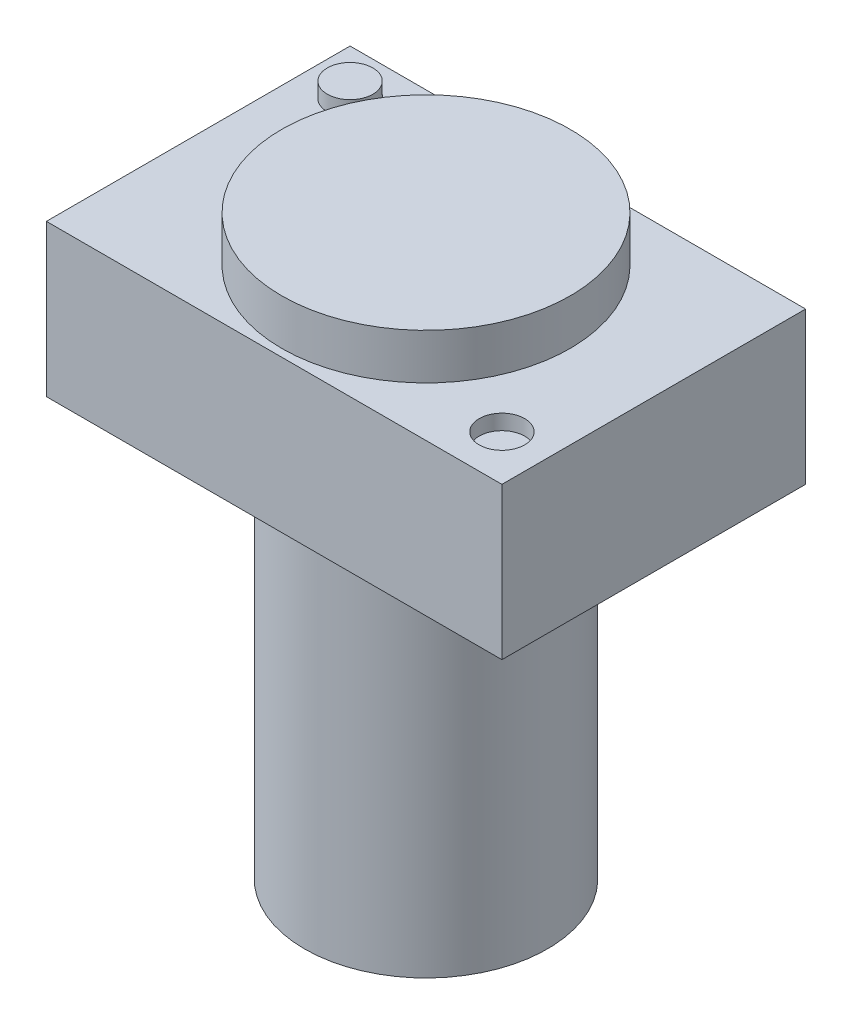
ISO-10303-21;
HEADER;
FILE_DESCRIPTION(('STEP AP214'),'2;1');
FILE_NAME('part.step','',(''),(''),'','','');
FILE_SCHEMA(('AUTOMOTIVE_DESIGN { 1 0 10303 214 1 1 1 1 }'));
ENDSEC;
DATA;
#1=APPLICATION_CONTEXT('core data for automotive mechanical design processes');
#2=APPLICATION_PROTOCOL_DEFINITION('international standard','automotive_design',2000,#1);
#3=PRODUCT_CONTEXT('',#1,'mechanical');
#4=PRODUCT('Part','Part','',(#3));
#5=PRODUCT_RELATED_PRODUCT_CATEGORY('part','',(#4));
#6=PRODUCT_DEFINITION_FORMATION('','',#4);
#7=PRODUCT_DEFINITION_CONTEXT('part definition',#1,'design');
#8=PRODUCT_DEFINITION('design','',#6,#7);
#9=PRODUCT_DEFINITION_SHAPE('','',#8);
#10=(LENGTH_UNIT() NAMED_UNIT(*) SI_UNIT(.MILLI.,.METRE.));
#11=(NAMED_UNIT(*) PLANE_ANGLE_UNIT() SI_UNIT($,.RADIAN.));
#12=(NAMED_UNIT(*) SI_UNIT($,.STERADIAN.) SOLID_ANGLE_UNIT());
#13=UNCERTAINTY_MEASURE_WITH_UNIT(LENGTH_MEASURE(1.E-05),#10,'distance_accuracy_value','');
#14=(GEOMETRIC_REPRESENTATION_CONTEXT(3) GLOBAL_UNCERTAINTY_ASSIGNED_CONTEXT((#13)) GLOBAL_UNIT_ASSIGNED_CONTEXT((#10,
#11,#12)) REPRESENTATION_CONTEXT('',''));
#15=CARTESIAN_POINT('',(0.,0.,0.));
#16=DIRECTION('',(0.,0.,1.));
#17=DIRECTION('',(1.,0.,0.));
#18=AXIS2_PLACEMENT_3D('',#15,#16,#17);
#19=CARTESIAN_POINT('',(0.,-10.,0.));
#20=DIRECTION('',(-1.,0.,0.));
#21=DIRECTION('',(0.,0.,1.));
#22=AXIS2_PLACEMENT_3D('',#19,#20,#21);
#23=PLANE('',#22);
#24=DIRECTION('',(0.,0.,1.));
#25=VECTOR('',#24,1.);
#26=CARTESIAN_POINT('',(0.,0.,0.));
#27=LINE('',#26,#25);
#28=CARTESIAN_POINT('',(0.,0.,-20.));
#29=VERTEX_POINT('',#28);
#30=CARTESIAN_POINT('',(0.,0.,0.));
#31=VERTEX_POINT('',#30);
#32=EDGE_CURVE('E117',#29,#31,#27,.T.);
#33=ORIENTED_EDGE('',*,*,#32,.F.);
#34=DIRECTION('',(0.,1.,0.));
#35=VECTOR('',#34,1.);
#36=CARTESIAN_POINT('',(0.,-10.,-20.));
#37=LINE('',#36,#35);
#38=CARTESIAN_POINT('',(0.,-10.,-20.));
#39=VERTEX_POINT('',#38);
#40=EDGE_CURVE('E58',#39,#29,#37,.T.);
#41=ORIENTED_EDGE('',*,*,#40,.F.);
#42=DIRECTION('',(0.,0.,1.));
#43=VECTOR('',#42,1.);
#44=CARTESIAN_POINT('',(0.,-10.,0.));
#45=LINE('',#44,#43);
#46=CARTESIAN_POINT('',(0.,-10.,0.));
#47=VERTEX_POINT('',#46);
#48=EDGE_CURVE('E106',#39,#47,#45,.T.);
#49=ORIENTED_EDGE('',*,*,#48,.T.);
#50=DIRECTION('',(0.,1.,0.));
#51=VECTOR('',#50,1.);
#52=CARTESIAN_POINT('',(0.,-10.,0.));
#53=LINE('',#52,#51);
#54=EDGE_CURVE('E86',#47,#31,#53,.T.);
#55=ORIENTED_EDGE('',*,*,#54,.T.);
#56=EDGE_LOOP('',(#33,#41,#49,#55));
#57=FACE_BOUND('',#56,.T.);
#58=ADVANCED_FACE('F41',(#57),#23,.T.);
#59=CARTESIAN_POINT('',(0.,-10.,-20.));
#60=DIRECTION('',(0.,0.,-1.));
#61=DIRECTION('',(-1.,0.,0.));
#62=AXIS2_PLACEMENT_3D('',#59,#60,#61);
#63=PLANE('',#62);
#64=DIRECTION('',(-1.,0.,0.));
#65=VECTOR('',#64,1.);
#66=CARTESIAN_POINT('',(0.,0.,-20.));
#67=LINE('',#66,#65);
#68=CARTESIAN_POINT('',(30.,0.,-20.));
#69=VERTEX_POINT('',#68);
#70=EDGE_CURVE('E111',#69,#29,#67,.T.);
#71=ORIENTED_EDGE('',*,*,#70,.F.);
#72=DIRECTION('',(0.,1.,0.));
#73=VECTOR('',#72,1.);
#74=CARTESIAN_POINT('',(30.,-10.,-20.));
#75=LINE('',#74,#73);
#76=CARTESIAN_POINT('',(30.,-10.,-20.));
#77=VERTEX_POINT('',#76);
#78=EDGE_CURVE('E75',#77,#69,#75,.T.);
#79=ORIENTED_EDGE('',*,*,#78,.F.);
#80=DIRECTION('',(-1.,0.,0.));
#81=VECTOR('',#80,1.);
#82=CARTESIAN_POINT('',(0.,-10.,-20.));
#83=LINE('',#82,#81);
#84=EDGE_CURVE('E101',#77,#39,#83,.T.);
#85=ORIENTED_EDGE('',*,*,#84,.T.);
#86=ORIENTED_EDGE('',*,*,#40,.T.);
#87=EDGE_LOOP('',(#71,#79,#85,#86));
#88=FACE_BOUND('',#87,.T.);
#89=ADVANCED_FACE('F139',(#88),#63,.T.);
#90=CARTESIAN_POINT('',(30.,-10.,0.));
#91=DIRECTION('',(1.,0.,0.));
#92=DIRECTION('',(0.,0.,-1.));
#93=AXIS2_PLACEMENT_3D('',#90,#91,#92);
#94=PLANE('',#93);
#95=DIRECTION('',(0.,0.,-1.));
#96=VECTOR('',#95,1.);
#97=CARTESIAN_POINT('',(30.,0.,0.));
#98=LINE('',#97,#96);
#99=CARTESIAN_POINT('',(30.,0.,0.));
#100=VERTEX_POINT('',#99);
#101=EDGE_CURVE('E94',#100,#69,#98,.T.);
#102=ORIENTED_EDGE('',*,*,#101,.F.);
#103=DIRECTION('',(0.,1.,0.));
#104=VECTOR('',#103,1.);
#105=CARTESIAN_POINT('',(30.,-10.,0.));
#106=LINE('',#105,#104);
#107=CARTESIAN_POINT('',(30.,-10.,0.));
#108=VERTEX_POINT('',#107);
#109=EDGE_CURVE('E89',#108,#100,#106,.T.);
#110=ORIENTED_EDGE('',*,*,#109,.F.);
#111=DIRECTION('',(0.,0.,-1.));
#112=VECTOR('',#111,1.);
#113=CARTESIAN_POINT('',(30.,-10.,0.));
#114=LINE('',#113,#112);
#115=EDGE_CURVE('E92',#108,#77,#114,.T.);
#116=ORIENTED_EDGE('',*,*,#115,.T.);
#117=ORIENTED_EDGE('',*,*,#78,.T.);
#118=EDGE_LOOP('',(#102,#110,#116,#117));
#119=FACE_BOUND('',#118,.T.);
#120=ADVANCED_FACE('F91',(#119),#94,.T.);
#121=CARTESIAN_POINT('',(0.,-10.,0.));
#122=DIRECTION('',(0.,0.,1.));
#123=DIRECTION('',(1.,0.,0.));
#124=AXIS2_PLACEMENT_3D('',#121,#122,#123);
#125=PLANE('',#124);
#126=DIRECTION('',(1.,0.,0.));
#127=VECTOR('',#126,1.);
#128=CARTESIAN_POINT('',(0.,0.,0.));
#129=LINE('',#128,#127);
#130=EDGE_CURVE('E121',#31,#100,#129,.T.);
#131=ORIENTED_EDGE('',*,*,#130,.F.);
#132=ORIENTED_EDGE('',*,*,#54,.F.);
#133=DIRECTION('',(1.,0.,0.));
#134=VECTOR('',#133,1.);
#135=CARTESIAN_POINT('',(0.,-10.,0.));
#136=LINE('',#135,#134);
#137=EDGE_CURVE('E100',#47,#108,#136,.T.);
#138=ORIENTED_EDGE('',*,*,#137,.T.);
#139=ORIENTED_EDGE('',*,*,#109,.T.);
#140=EDGE_LOOP('',(#131,#132,#138,#139));
#141=FACE_BOUND('',#140,.T.);
#142=ADVANCED_FACE('F104',(#141),#125,.T.);
#143=CARTESIAN_POINT('',(0.,-10.,0.));
#144=DIRECTION('',(0.,-1.,0.));
#145=DIRECTION('',(0.,0.,-1.));
#146=AXIS2_PLACEMENT_3D('',#143,#144,#145);
#147=PLANE('',#146);
#148=CARTESIAN_POINT('',(15.,-10.,-10.));
#149=DIRECTION('',(0.,-1.,0.));
#150=DIRECTION('',(0.,0.,-1.));
#151=AXIS2_PLACEMENT_3D('',#148,#149,#150);
#152=CIRCLE('',#151,8.);
#153=CARTESIAN_POINT('',(15.,-10.,-18.));
#154=VERTEX_POINT('',#153);
#155=EDGE_CURVE('E132',#154,#154,#152,.T.);
#156=ORIENTED_EDGE('',*,*,#155,.F.);
#157=EDGE_LOOP('',(#156));
#158=FACE_BOUND('',#157,.T.);
#159=ORIENTED_EDGE('',*,*,#48,.F.);
#160=ORIENTED_EDGE('',*,*,#84,.F.);
#161=ORIENTED_EDGE('',*,*,#115,.F.);
#162=ORIENTED_EDGE('',*,*,#137,.F.);
#163=EDGE_LOOP('',(#159,#160,#161,#162));
#164=FACE_BOUND('',#163,.T.);
#165=ADVANCED_FACE('F99',(#158,#164),#147,.T.);
#166=CARTESIAN_POINT('',(0.,0.,0.));
#167=DIRECTION('',(0.,-1.,0.));
#168=DIRECTION('',(0.,0.,-1.));
#169=AXIS2_PLACEMENT_3D('',#166,#167,#168);
#170=PLANE('',#169);
#171=CARTESIAN_POINT('',(27.,0.,-3.));
#172=DIRECTION('',(0.,1.,0.));
#173=DIRECTION('',(0.,0.,1.));
#174=AXIS2_PLACEMENT_3D('',#171,#172,#173);
#175=CIRCLE('',#174,1.5);
#176=CARTESIAN_POINT('',(27.,0.,-1.5));
#177=VERTEX_POINT('',#176);
#178=EDGE_CURVE('E198',#177,#177,#175,.T.);
#179=ORIENTED_EDGE('',*,*,#178,.F.);
#180=EDGE_LOOP('',(#179));
#181=FACE_BOUND('',#180,.T.);
#182=CARTESIAN_POINT('',(3.,0.,-17.));
#183=DIRECTION('',(0.,-1.,0.));
#184=DIRECTION('',(0.,0.,-1.));
#185=AXIS2_PLACEMENT_3D('',#182,#183,#184);
#186=CIRCLE('',#185,1.5);
#187=CARTESIAN_POINT('',(3.,0.,-18.5));
#188=VERTEX_POINT('',#187);
#189=EDGE_CURVE('E11',#188,#188,#186,.F.);
#190=ORIENTED_EDGE('',*,*,#189,.F.);
#191=EDGE_LOOP('',(#190));
#192=FACE_BOUND('',#191,.T.);
#193=CARTESIAN_POINT('',(15.,0.,-10.));
#194=DIRECTION('',(0.,1.,0.));
#195=DIRECTION('',(0.,0.,1.));
#196=AXIS2_PLACEMENT_3D('',#193,#194,#195);
#197=CIRCLE('',#196,9.5);
#198=CARTESIAN_POINT('',(15.,0.,-0.499999999999999));
#199=VERTEX_POINT('',#198);
#200=EDGE_CURVE('E50',#199,#199,#197,.T.);
#201=ORIENTED_EDGE('',*,*,#200,.F.);
#202=EDGE_LOOP('',(#201));
#203=FACE_BOUND('',#202,.T.);
#204=ORIENTED_EDGE('',*,*,#32,.T.);
#205=ORIENTED_EDGE('',*,*,#130,.T.);
#206=ORIENTED_EDGE('',*,*,#101,.T.);
#207=ORIENTED_EDGE('',*,*,#70,.T.);
#208=EDGE_LOOP('',(#204,#205,#206,#207));
#209=FACE_BOUND('',#208,.T.);
#210=ADVANCED_FACE('F138',(#181,#192,#203,#209),#170,.F.);
#211=CARTESIAN_POINT('',(15.,-35.,-10.));
#212=DIRECTION('',(0.,1.,0.));
#213=DIRECTION('',(0.,0.,1.));
#214=AXIS2_PLACEMENT_3D('',#211,#212,#213);
#215=CYLINDRICAL_SURFACE('',#214,8.);
#216=CARTESIAN_POINT('',(15.,-35.,-10.));
#217=DIRECTION('',(0.,-1.,0.));
#218=DIRECTION('',(0.,0.,-1.));
#219=AXIS2_PLACEMENT_3D('',#216,#217,#218);
#220=CIRCLE('',#219,8.);
#221=CARTESIAN_POINT('',(15.,-35.,-18.));
#222=VERTEX_POINT('',#221);
#223=EDGE_CURVE('E122',#222,#222,#220,.T.);
#224=ORIENTED_EDGE('',*,*,#223,.F.);
#225=EDGE_LOOP('',(#224));
#226=FACE_BOUND('',#225,.T.);
#227=ORIENTED_EDGE('',*,*,#155,.T.);
#228=EDGE_LOOP('',(#227));
#229=FACE_BOUND('',#228,.T.);
#230=ADVANCED_FACE('F157',(#226,#229),#215,.T.);
#231=CARTESIAN_POINT('',(15.,-35.,-10.));
#232=DIRECTION('',(0.,-1.,0.));
#233=DIRECTION('',(0.,0.,-1.));
#234=AXIS2_PLACEMENT_3D('',#231,#232,#233);
#235=PLANE('',#234);
#236=ORIENTED_EDGE('',*,*,#223,.T.);
#237=EDGE_LOOP('',(#236));
#238=FACE_BOUND('',#237,.T.);
#239=ADVANCED_FACE('F163',(#238),#235,.T.);
#240=CARTESIAN_POINT('',(15.,3.,-10.));
#241=DIRECTION('',(0.,-1.,0.));
#242=DIRECTION('',(0.,0.,-1.));
#243=AXIS2_PLACEMENT_3D('',#240,#241,#242);
#244=CYLINDRICAL_SURFACE('',#243,9.5);
#245=CARTESIAN_POINT('',(15.,3.,-10.));
#246=DIRECTION('',(0.,1.,0.));
#247=DIRECTION('',(0.,0.,1.));
#248=AXIS2_PLACEMENT_3D('',#245,#246,#247);
#249=CIRCLE('',#248,9.5);
#250=CARTESIAN_POINT('',(15.,3.,-0.499999999999999));
#251=VERTEX_POINT('',#250);
#252=EDGE_CURVE('E205',#251,#251,#249,.T.);
#253=ORIENTED_EDGE('',*,*,#252,.F.);
#254=EDGE_LOOP('',(#253));
#255=FACE_BOUND('',#254,.T.);
#256=ORIENTED_EDGE('',*,*,#200,.T.);
#257=EDGE_LOOP('',(#256));
#258=FACE_BOUND('',#257,.T.);
#259=ADVANCED_FACE('F167',(#255,#258),#244,.T.);
#260=CARTESIAN_POINT('',(15.,3.,-10.));
#261=DIRECTION('',(0.,1.,0.));
#262=DIRECTION('',(0.,0.,1.));
#263=AXIS2_PLACEMENT_3D('',#260,#261,#262);
#264=PLANE('',#263);
#265=ORIENTED_EDGE('',*,*,#252,.T.);
#266=EDGE_LOOP('',(#265));
#267=FACE_BOUND('',#266,.T.);
#268=ADVANCED_FACE('F171',(#267),#264,.T.);
#269=CARTESIAN_POINT('',(3.,1.,-17.));
#270=DIRECTION('',(0.,-1.,0.));
#271=DIRECTION('',(0.,0.,-1.));
#272=AXIS2_PLACEMENT_3D('',#269,#270,#271);
#273=CYLINDRICAL_SURFACE('',#272,1.5);
#274=CARTESIAN_POINT('',(3.,1.,-17.));
#275=DIRECTION('',(0.,1.,0.));
#276=DIRECTION('',(0.,0.,1.));
#277=AXIS2_PLACEMENT_3D('',#274,#275,#276);
#278=CIRCLE('',#277,1.5);
#279=CARTESIAN_POINT('',(3.,1.,-15.5));
#280=VERTEX_POINT('',#279);
#281=EDGE_CURVE('E197',#280,#280,#278,.T.);
#282=ORIENTED_EDGE('',*,*,#281,.F.);
#283=EDGE_LOOP('',(#282));
#284=FACE_BOUND('',#283,.T.);
#285=ORIENTED_EDGE('',*,*,#189,.T.);
#286=EDGE_LOOP('',(#285));
#287=FACE_BOUND('',#286,.T.);
#288=ADVANCED_FACE('F175',(#284,#287),#273,.T.);
#289=CARTESIAN_POINT('',(3.,1.,-17.));
#290=DIRECTION('',(0.,1.,0.));
#291=DIRECTION('',(0.,0.,1.));
#292=AXIS2_PLACEMENT_3D('',#289,#290,#291);
#293=PLANE('',#292);
#294=ORIENTED_EDGE('',*,*,#281,.T.);
#295=EDGE_LOOP('',(#294));
#296=FACE_BOUND('',#295,.T.);
#297=ADVANCED_FACE('F179',(#296),#293,.T.);
#298=CARTESIAN_POINT('',(27.,-1.,-3.));
#299=DIRECTION('',(0.,1.,0.));
#300=DIRECTION('',(0.,0.,1.));
#301=AXIS2_PLACEMENT_3D('',#298,#299,#300);
#302=CYLINDRICAL_SURFACE('',#301,1.5);
#303=CARTESIAN_POINT('',(27.,-1.,-3.));
#304=DIRECTION('',(0.,1.,0.));
#305=DIRECTION('',(0.,0.,1.));
#306=AXIS2_PLACEMENT_3D('',#303,#304,#305);
#307=CIRCLE('',#306,1.5);
#308=CARTESIAN_POINT('',(27.,-1.,-1.5));
#309=VERTEX_POINT('',#308);
#310=EDGE_CURVE('E195',#309,#309,#307,.T.);
#311=ORIENTED_EDGE('',*,*,#310,.F.);
#312=EDGE_LOOP('',(#311));
#313=FACE_BOUND('',#312,.T.);
#314=ORIENTED_EDGE('',*,*,#178,.T.);
#315=EDGE_LOOP('',(#314));
#316=FACE_BOUND('',#315,.T.);
#317=ADVANCED_FACE('F183',(#313,#316),#302,.F.);
#318=CARTESIAN_POINT('',(27.,-1.,-3.));
#319=DIRECTION('',(0.,1.,0.));
#320=DIRECTION('',(0.,0.,1.));
#321=AXIS2_PLACEMENT_3D('',#318,#319,#320);
#322=PLANE('',#321);
#323=ORIENTED_EDGE('',*,*,#310,.T.);
#324=EDGE_LOOP('',(#323));
#325=FACE_BOUND('',#324,.T.);
#326=ADVANCED_FACE('F187',(#325),#322,.T.);
#327=CLOSED_SHELL('',(#58,#89,#120,#142,#165,#210,#230,#239,#259,#268,#288,#297,#317,#326));
#328=MANIFOLD_SOLID_BREP('B2',#327);
#329=ADVANCED_BREP_SHAPE_REPRESENTATION('',(#18,#328),#14);
#330=SHAPE_DEFINITION_REPRESENTATION(#9,#329);
ENDSEC;
END-ISO-10303-21;
